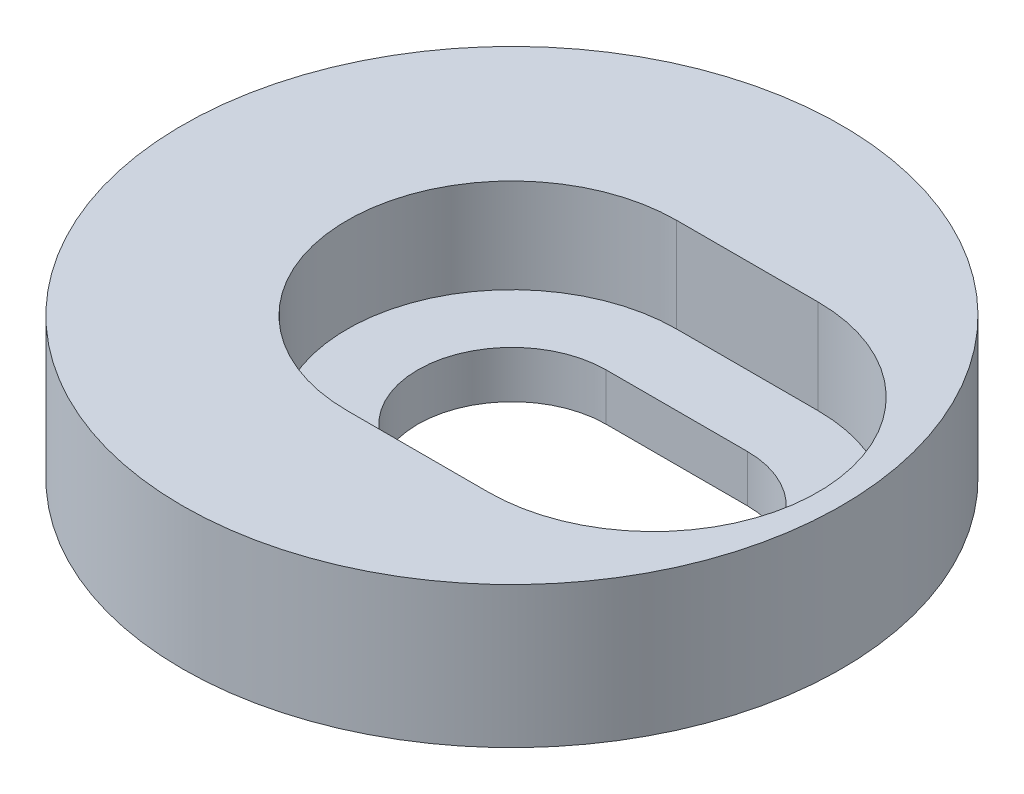
ISO-10303-21;
HEADER;
FILE_DESCRIPTION(('STEP AP214'),'2;1');
FILE_NAME('part.step','',(''),(''),'','','');
FILE_SCHEMA(('AUTOMOTIVE_DESIGN { 1 0 10303 214 1 1 1 1 }'));
ENDSEC;
DATA;
#1=APPLICATION_CONTEXT('core data for automotive mechanical design processes');
#2=APPLICATION_PROTOCOL_DEFINITION('international standard','automotive_design',2000,#1);
#3=PRODUCT_CONTEXT('',#1,'mechanical');
#4=PRODUCT('Part','Part','',(#3));
#5=PRODUCT_RELATED_PRODUCT_CATEGORY('part','',(#4));
#6=PRODUCT_DEFINITION_FORMATION('','',#4);
#7=PRODUCT_DEFINITION_CONTEXT('part definition',#1,'design');
#8=PRODUCT_DEFINITION('design','',#6,#7);
#9=PRODUCT_DEFINITION_SHAPE('','',#8);
#10=(LENGTH_UNIT() NAMED_UNIT(*) SI_UNIT(.MILLI.,.METRE.));
#11=(NAMED_UNIT(*) PLANE_ANGLE_UNIT() SI_UNIT($,.RADIAN.));
#12=(NAMED_UNIT(*) SI_UNIT($,.STERADIAN.) SOLID_ANGLE_UNIT());
#13=UNCERTAINTY_MEASURE_WITH_UNIT(LENGTH_MEASURE(1.E-05),#10,'distance_accuracy_value','');
#14=(GEOMETRIC_REPRESENTATION_CONTEXT(3) GLOBAL_UNCERTAINTY_ASSIGNED_CONTEXT((#13)) GLOBAL_UNIT_ASSIGNED_CONTEXT((#10,
#11,#12)) REPRESENTATION_CONTEXT('',''));
#15=CARTESIAN_POINT('',(0.,0.,0.));
#16=DIRECTION('',(0.,0.,1.));
#17=DIRECTION('',(1.,0.,0.));
#18=AXIS2_PLACEMENT_3D('',#15,#16,#17);
#19=CARTESIAN_POINT('',(0.,3.5,0.));
#20=DIRECTION('',(0.,-1.,0.));
#21=DIRECTION('',(0.,0.,-1.));
#22=AXIS2_PLACEMENT_3D('',#19,#20,#21);
#23=CYLINDRICAL_SURFACE('',#22,7.);
#24=CARTESIAN_POINT('',(0.,3.5,0.));
#25=DIRECTION('',(0.,1.,0.));
#26=DIRECTION('',(0.,0.,1.));
#27=AXIS2_PLACEMENT_3D('',#24,#25,#26);
#28=CIRCLE('',#27,7.);
#29=CARTESIAN_POINT('',(0.,3.5,7.));
#30=VERTEX_POINT('',#29);
#31=EDGE_CURVE('E160',#30,#30,#28,.T.);
#32=ORIENTED_EDGE('',*,*,#31,.F.);
#33=EDGE_LOOP('',(#32));
#34=FACE_BOUND('',#33,.T.);
#35=CARTESIAN_POINT('',(0.,0.5,0.));
#36=DIRECTION('',(0.,1.,0.));
#37=DIRECTION('',(0.,0.,1.));
#38=AXIS2_PLACEMENT_3D('',#35,#36,#37);
#39=CIRCLE('',#38,7.);
#40=CARTESIAN_POINT('',(0.,0.5,7.));
#41=VERTEX_POINT('',#40);
#42=EDGE_CURVE('E153',#41,#41,#39,.T.);
#43=ORIENTED_EDGE('',*,*,#42,.T.);
#44=EDGE_LOOP('',(#43));
#45=FACE_BOUND('',#44,.T.);
#46=ADVANCED_FACE('F36',(#34,#45),#23,.T.);
#47=CARTESIAN_POINT('',(0.,3.5,0.));
#48=DIRECTION('',(0.,1.,0.));
#49=DIRECTION('',(0.,0.,1.));
#50=AXIS2_PLACEMENT_3D('',#47,#48,#49);
#51=PLANE('',#50);
#52=DIRECTION('',(1.,0.,0.));
#53=VECTOR('',#52,1.);
#54=CARTESIAN_POINT('',(0.,3.5,3.5));
#55=LINE('',#54,#53);
#56=CARTESIAN_POINT('',(0.,3.5,3.5));
#57=VERTEX_POINT('',#56);
#58=CARTESIAN_POINT('',(3.,3.5,3.5));
#59=VERTEX_POINT('',#58);
#60=EDGE_CURVE('E125',#57,#59,#55,.T.);
#61=ORIENTED_EDGE('',*,*,#60,.F.);
#62=CARTESIAN_POINT('',(0.,3.5,0.));
#63=DIRECTION('',(0.,1.,0.));
#64=DIRECTION('',(0.,0.,1.));
#65=AXIS2_PLACEMENT_3D('',#62,#63,#64);
#66=CIRCLE('',#65,3.5);
#67=CARTESIAN_POINT('',(0.,3.5,-3.5));
#68=VERTEX_POINT('',#67);
#69=EDGE_CURVE('E133',#68,#57,#66,.T.);
#70=ORIENTED_EDGE('',*,*,#69,.F.);
#71=DIRECTION('',(1.,0.,0.));
#72=VECTOR('',#71,1.);
#73=CARTESIAN_POINT('',(0.,3.5,-3.5));
#74=LINE('',#73,#72);
#75=CARTESIAN_POINT('',(3.,3.5,-3.5));
#76=VERTEX_POINT('',#75);
#77=EDGE_CURVE('E146',#68,#76,#74,.T.);
#78=ORIENTED_EDGE('',*,*,#77,.T.);
#79=CARTESIAN_POINT('',(3.,3.5,0.));
#80=DIRECTION('',(0.,1.,0.));
#81=DIRECTION('',(0.,0.,1.));
#82=AXIS2_PLACEMENT_3D('',#79,#80,#81);
#83=CIRCLE('',#82,3.5);
#84=EDGE_CURVE('E143',#59,#76,#83,.T.);
#85=ORIENTED_EDGE('',*,*,#84,.F.);
#86=EDGE_LOOP('',(#61,#70,#78,#85));
#87=FACE_BOUND('',#86,.T.);
#88=ORIENTED_EDGE('',*,*,#31,.T.);
#89=EDGE_LOOP('',(#88));
#90=FACE_BOUND('',#89,.T.);
#91=ADVANCED_FACE('F184',(#87,#90),#51,.T.);
#92=CARTESIAN_POINT('',(0.,0.5,0.));
#93=DIRECTION('',(0.,1.,0.));
#94=DIRECTION('',(0.,0.,1.));
#95=AXIS2_PLACEMENT_3D('',#92,#93,#94);
#96=PLANE('',#95);
#97=DIRECTION('',(-1.,0.,0.));
#98=VECTOR('',#97,1.);
#99=CARTESIAN_POINT('',(0.,0.5,-2.));
#100=LINE('',#99,#98);
#101=CARTESIAN_POINT('',(3.,0.5,-2.));
#102=VERTEX_POINT('',#101);
#103=CARTESIAN_POINT('',(0.,0.5,-2.));
#104=VERTEX_POINT('',#103);
#105=EDGE_CURVE('E43',#102,#104,#100,.T.);
#106=ORIENTED_EDGE('',*,*,#105,.T.);
#107=CARTESIAN_POINT('',(0.,0.5,0.));
#108=DIRECTION('',(0.,1.,0.));
#109=DIRECTION('',(0.,0.,1.));
#110=AXIS2_PLACEMENT_3D('',#107,#108,#109);
#111=CIRCLE('',#110,2.);
#112=CARTESIAN_POINT('',(0.,0.5,2.));
#113=VERTEX_POINT('',#112);
#114=EDGE_CURVE('E11',#104,#113,#111,.T.);
#115=ORIENTED_EDGE('',*,*,#114,.T.);
#116=DIRECTION('',(1.,0.,0.));
#117=VECTOR('',#116,1.);
#118=CARTESIAN_POINT('',(0.,0.5,2.));
#119=LINE('',#118,#117);
#120=CARTESIAN_POINT('',(3.,0.5,2.));
#121=VERTEX_POINT('',#120);
#122=EDGE_CURVE('E105',#113,#121,#119,.T.);
#123=ORIENTED_EDGE('',*,*,#122,.T.);
#124=CARTESIAN_POINT('',(3.,0.5,0.));
#125=DIRECTION('',(0.,1.,0.));
#126=DIRECTION('',(0.,0.,1.));
#127=AXIS2_PLACEMENT_3D('',#124,#125,#126);
#128=CIRCLE('',#127,2.);
#129=EDGE_CURVE('E166',#121,#102,#128,.T.);
#130=ORIENTED_EDGE('',*,*,#129,.T.);
#131=EDGE_LOOP('',(#106,#115,#123,#130));
#132=FACE_BOUND('',#131,.T.);
#133=ORIENTED_EDGE('',*,*,#42,.F.);
#134=EDGE_LOOP('',(#133));
#135=FACE_BOUND('',#134,.T.);
#136=ADVANCED_FACE('F170',(#132,#135),#96,.F.);
#137=CARTESIAN_POINT('',(0.,1.5,3.5));
#138=DIRECTION('',(0.,0.,1.));
#139=DIRECTION('',(1.,0.,0.));
#140=AXIS2_PLACEMENT_3D('',#137,#138,#139);
#141=PLANE('',#140);
#142=ORIENTED_EDGE('',*,*,#60,.T.);
#143=DIRECTION('',(0.,1.,0.));
#144=VECTOR('',#143,1.);
#145=CARTESIAN_POINT('',(3.,1.5,3.5));
#146=LINE('',#145,#144);
#147=CARTESIAN_POINT('',(3.,1.5,3.5));
#148=VERTEX_POINT('',#147);
#149=EDGE_CURVE('E141',#148,#59,#146,.T.);
#150=ORIENTED_EDGE('',*,*,#149,.F.);
#151=DIRECTION('',(1.,0.,0.));
#152=VECTOR('',#151,1.);
#153=CARTESIAN_POINT('',(0.,1.5,3.5));
#154=LINE('',#153,#152);
#155=CARTESIAN_POINT('',(0.,1.5,3.5));
#156=VERTEX_POINT('',#155);
#157=EDGE_CURVE('E129',#156,#148,#154,.T.);
#158=ORIENTED_EDGE('',*,*,#157,.F.);
#159=DIRECTION('',(0.,1.,0.));
#160=VECTOR('',#159,1.);
#161=CARTESIAN_POINT('',(0.,1.5,3.5));
#162=LINE('',#161,#160);
#163=EDGE_CURVE('E151',#156,#57,#162,.T.);
#164=ORIENTED_EDGE('',*,*,#163,.T.);
#165=EDGE_LOOP('',(#142,#150,#158,#164));
#166=FACE_BOUND('',#165,.T.);
#167=ADVANCED_FACE('F195',(#166),#141,.F.);
#168=CARTESIAN_POINT('',(0.,1.5,0.));
#169=DIRECTION('',(0.,1.,0.));
#170=DIRECTION('',(0.,0.,1.));
#171=AXIS2_PLACEMENT_3D('',#168,#169,#170);
#172=CYLINDRICAL_SURFACE('',#171,3.5);
#173=ORIENTED_EDGE('',*,*,#69,.T.);
#174=ORIENTED_EDGE('',*,*,#163,.F.);
#175=CARTESIAN_POINT('',(0.,1.5,0.));
#176=DIRECTION('',(0.,1.,0.));
#177=DIRECTION('',(0.,0.,1.));
#178=AXIS2_PLACEMENT_3D('',#175,#176,#177);
#179=CIRCLE('',#178,3.5);
#180=CARTESIAN_POINT('',(0.,1.5,-3.5));
#181=VERTEX_POINT('',#180);
#182=EDGE_CURVE('E138',#181,#156,#179,.T.);
#183=ORIENTED_EDGE('',*,*,#182,.F.);
#184=DIRECTION('',(0.,1.,0.));
#185=VECTOR('',#184,1.);
#186=CARTESIAN_POINT('',(0.,1.5,-3.5));
#187=LINE('',#186,#185);
#188=EDGE_CURVE('E154',#181,#68,#187,.T.);
#189=ORIENTED_EDGE('',*,*,#188,.T.);
#190=EDGE_LOOP('',(#173,#174,#183,#189));
#191=FACE_BOUND('',#190,.T.);
#192=ADVANCED_FACE('F199',(#191),#172,.F.);
#193=CARTESIAN_POINT('',(0.,1.5,-3.5));
#194=DIRECTION('',(0.,0.,1.));
#195=DIRECTION('',(1.,0.,0.));
#196=AXIS2_PLACEMENT_3D('',#193,#194,#195);
#197=PLANE('',#196);
#198=ORIENTED_EDGE('',*,*,#77,.F.);
#199=ORIENTED_EDGE('',*,*,#188,.F.);
#200=DIRECTION('',(1.,0.,0.));
#201=VECTOR('',#200,1.);
#202=CARTESIAN_POINT('',(0.,1.5,-3.5));
#203=LINE('',#202,#201);
#204=CARTESIAN_POINT('',(3.,1.5,-3.5));
#205=VERTEX_POINT('',#204);
#206=EDGE_CURVE('E136',#181,#205,#203,.T.);
#207=ORIENTED_EDGE('',*,*,#206,.T.);
#208=DIRECTION('',(0.,1.,0.));
#209=VECTOR('',#208,1.);
#210=CARTESIAN_POINT('',(3.,1.5,-3.5));
#211=LINE('',#210,#209);
#212=EDGE_CURVE('E156',#205,#76,#211,.T.);
#213=ORIENTED_EDGE('',*,*,#212,.T.);
#214=EDGE_LOOP('',(#198,#199,#207,#213));
#215=FACE_BOUND('',#214,.T.);
#216=ADVANCED_FACE('F206',(#215),#197,.T.);
#217=CARTESIAN_POINT('',(3.,1.5,0.));
#218=DIRECTION('',(0.,1.,0.));
#219=DIRECTION('',(0.,0.,1.));
#220=AXIS2_PLACEMENT_3D('',#217,#218,#219);
#221=CYLINDRICAL_SURFACE('',#220,3.5);
#222=ORIENTED_EDGE('',*,*,#84,.T.);
#223=ORIENTED_EDGE('',*,*,#212,.F.);
#224=CARTESIAN_POINT('',(3.,1.5,0.));
#225=DIRECTION('',(0.,1.,0.));
#226=DIRECTION('',(0.,0.,1.));
#227=AXIS2_PLACEMENT_3D('',#224,#225,#226);
#228=CIRCLE('',#227,3.5);
#229=EDGE_CURVE('E132',#148,#205,#228,.T.);
#230=ORIENTED_EDGE('',*,*,#229,.F.);
#231=ORIENTED_EDGE('',*,*,#149,.T.);
#232=EDGE_LOOP('',(#222,#223,#230,#231));
#233=FACE_BOUND('',#232,.T.);
#234=ADVANCED_FACE('F203',(#233),#221,.F.);
#235=CARTESIAN_POINT('',(0.,1.5,0.));
#236=DIRECTION('',(0.,1.,0.));
#237=DIRECTION('',(0.,0.,1.));
#238=AXIS2_PLACEMENT_3D('',#235,#236,#237);
#239=PLANE('',#238);
#240=CARTESIAN_POINT('',(0.,1.5,0.));
#241=DIRECTION('',(0.,1.,0.));
#242=DIRECTION('',(0.,0.,1.));
#243=AXIS2_PLACEMENT_3D('',#240,#241,#242);
#244=CIRCLE('',#243,2.);
#245=CARTESIAN_POINT('',(0.,1.5,-2.));
#246=VERTEX_POINT('',#245);
#247=CARTESIAN_POINT('',(0.,1.5,2.));
#248=VERTEX_POINT('',#247);
#249=EDGE_CURVE('E110',#246,#248,#244,.T.);
#250=ORIENTED_EDGE('',*,*,#249,.F.);
#251=DIRECTION('',(-1.,0.,0.));
#252=VECTOR('',#251,1.);
#253=CARTESIAN_POINT('',(3.,1.5,-2.));
#254=LINE('',#253,#252);
#255=CARTESIAN_POINT('',(3.,1.5,-2.));
#256=VERTEX_POINT('',#255);
#257=EDGE_CURVE('E107',#256,#246,#254,.T.);
#258=ORIENTED_EDGE('',*,*,#257,.F.);
#259=CARTESIAN_POINT('',(3.,1.5,0.));
#260=DIRECTION('',(0.,1.,0.));
#261=DIRECTION('',(0.,0.,1.));
#262=AXIS2_PLACEMENT_3D('',#259,#260,#261);
#263=CIRCLE('',#262,2.);
#264=CARTESIAN_POINT('',(3.,1.5,2.));
#265=VERTEX_POINT('',#264);
#266=EDGE_CURVE('E50',#265,#256,#263,.T.);
#267=ORIENTED_EDGE('',*,*,#266,.F.);
#268=DIRECTION('',(1.,0.,0.));
#269=VECTOR('',#268,1.);
#270=CARTESIAN_POINT('',(0.,1.5,2.));
#271=LINE('',#270,#269);
#272=EDGE_CURVE('E103',#248,#265,#271,.T.);
#273=ORIENTED_EDGE('',*,*,#272,.F.);
#274=EDGE_LOOP('',(#250,#258,#267,#273));
#275=FACE_BOUND('',#274,.T.);
#276=ORIENTED_EDGE('',*,*,#157,.T.);
#277=ORIENTED_EDGE('',*,*,#229,.T.);
#278=ORIENTED_EDGE('',*,*,#206,.F.);
#279=ORIENTED_EDGE('',*,*,#182,.T.);
#280=EDGE_LOOP('',(#276,#277,#278,#279));
#281=FACE_BOUND('',#280,.T.);
#282=ADVANCED_FACE('F118',(#275,#281),#239,.T.);
#283=CARTESIAN_POINT('',(0.,-0.5,0.));
#284=DIRECTION('',(0.,1.,0.));
#285=DIRECTION('',(0.,0.,1.));
#286=AXIS2_PLACEMENT_3D('',#283,#284,#285);
#287=CYLINDRICAL_SURFACE('',#286,2.);
#288=DIRECTION('',(0.,1.,0.));
#289=VECTOR('',#288,1.);
#290=CARTESIAN_POINT('',(0.,-0.5,-2.));
#291=LINE('',#290,#289);
#292=EDGE_CURVE('E113',#104,#246,#291,.T.);
#293=ORIENTED_EDGE('',*,*,#292,.T.);
#294=ORIENTED_EDGE('',*,*,#249,.T.);
#295=DIRECTION('',(0.,1.,0.));
#296=VECTOR('',#295,1.);
#297=CARTESIAN_POINT('',(0.,-0.5,2.));
#298=LINE('',#297,#296);
#299=EDGE_CURVE('E99',#113,#248,#298,.T.);
#300=ORIENTED_EDGE('',*,*,#299,.F.);
#301=ORIENTED_EDGE('',*,*,#114,.F.);
#302=EDGE_LOOP('',(#293,#294,#300,#301));
#303=FACE_BOUND('',#302,.T.);
#304=ADVANCED_FACE('F111',(#303),#287,.F.);
#305=CARTESIAN_POINT('',(3.,-0.5,-2.));
#306=DIRECTION('',(0.,0.,-1.));
#307=DIRECTION('',(-1.,0.,0.));
#308=AXIS2_PLACEMENT_3D('',#305,#306,#307);
#309=PLANE('',#308);
#310=DIRECTION('',(0.,1.,0.));
#311=VECTOR('',#310,1.);
#312=CARTESIAN_POINT('',(3.,-0.5,-2.));
#313=LINE('',#312,#311);
#314=EDGE_CURVE('E126',#102,#256,#313,.T.);
#315=ORIENTED_EDGE('',*,*,#314,.T.);
#316=ORIENTED_EDGE('',*,*,#257,.T.);
#317=ORIENTED_EDGE('',*,*,#292,.F.);
#318=ORIENTED_EDGE('',*,*,#105,.F.);
#319=EDGE_LOOP('',(#315,#316,#317,#318));
#320=FACE_BOUND('',#319,.T.);
#321=ADVANCED_FACE('F173',(#320),#309,.F.);
#322=CARTESIAN_POINT('',(3.,-0.5,0.));
#323=DIRECTION('',(0.,1.,0.));
#324=DIRECTION('',(0.,0.,1.));
#325=AXIS2_PLACEMENT_3D('',#322,#323,#324);
#326=CYLINDRICAL_SURFACE('',#325,2.);
#327=DIRECTION('',(0.,1.,0.));
#328=VECTOR('',#327,1.);
#329=CARTESIAN_POINT('',(3.,-0.5,2.));
#330=LINE('',#329,#328);
#331=EDGE_CURVE('E57',#121,#265,#330,.T.);
#332=ORIENTED_EDGE('',*,*,#331,.T.);
#333=ORIENTED_EDGE('',*,*,#266,.T.);
#334=ORIENTED_EDGE('',*,*,#314,.F.);
#335=ORIENTED_EDGE('',*,*,#129,.F.);
#336=EDGE_LOOP('',(#332,#333,#334,#335));
#337=FACE_BOUND('',#336,.T.);
#338=ADVANCED_FACE('F174',(#337),#326,.F.);
#339=CARTESIAN_POINT('',(0.,-0.5,2.));
#340=DIRECTION('',(0.,0.,1.));
#341=DIRECTION('',(1.,0.,0.));
#342=AXIS2_PLACEMENT_3D('',#339,#340,#341);
#343=PLANE('',#342);
#344=ORIENTED_EDGE('',*,*,#299,.T.);
#345=ORIENTED_EDGE('',*,*,#272,.T.);
#346=ORIENTED_EDGE('',*,*,#331,.F.);
#347=ORIENTED_EDGE('',*,*,#122,.F.);
#348=EDGE_LOOP('',(#344,#345,#346,#347));
#349=FACE_BOUND('',#348,.T.);
#350=ADVANCED_FACE('F101',(#349),#343,.F.);
#351=CLOSED_SHELL('',(#46,#91,#136,#167,#192,#216,#234,#282,#304,#321,#338,#350));
#352=MANIFOLD_SOLID_BREP('B2',#351);
#353=ADVANCED_BREP_SHAPE_REPRESENTATION('',(#18,#352),#14);
#354=SHAPE_DEFINITION_REPRESENTATION(#9,#353);
ENDSEC;
END-ISO-10303-21;
